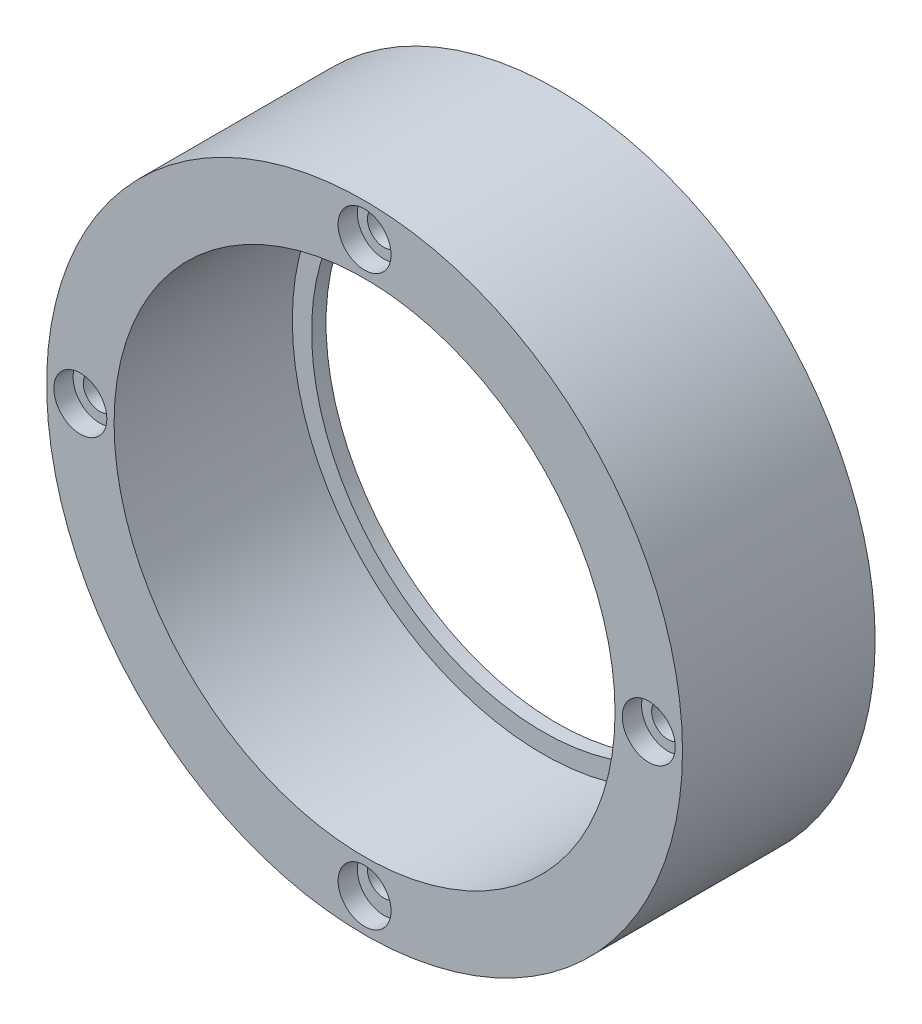
ISO-10303-21;
HEADER;
FILE_DESCRIPTION(('STEP AP214'),'2;1');
FILE_NAME('part.step','',(''),(''),'','','');
FILE_SCHEMA(('AUTOMOTIVE_DESIGN { 1 0 10303 214 1 1 1 1 }'));
ENDSEC;
DATA;
#1=APPLICATION_CONTEXT('core data for automotive mechanical design processes');
#2=APPLICATION_PROTOCOL_DEFINITION('international standard','automotive_design',2000,#1);
#3=PRODUCT_CONTEXT('',#1,'mechanical');
#4=PRODUCT('Part','Part','',(#3));
#5=PRODUCT_RELATED_PRODUCT_CATEGORY('part','',(#4));
#6=PRODUCT_DEFINITION_FORMATION('','',#4);
#7=PRODUCT_DEFINITION_CONTEXT('part definition',#1,'design');
#8=PRODUCT_DEFINITION('design','',#6,#7);
#9=PRODUCT_DEFINITION_SHAPE('','',#8);
#10=(LENGTH_UNIT() NAMED_UNIT(*) SI_UNIT(.MILLI.,.METRE.));
#11=(NAMED_UNIT(*) PLANE_ANGLE_UNIT() SI_UNIT($,.RADIAN.));
#12=(NAMED_UNIT(*) SI_UNIT($,.STERADIAN.) SOLID_ANGLE_UNIT());
#13=UNCERTAINTY_MEASURE_WITH_UNIT(LENGTH_MEASURE(1.E-05),#10,'distance_accuracy_value','');
#14=(GEOMETRIC_REPRESENTATION_CONTEXT(3) GLOBAL_UNCERTAINTY_ASSIGNED_CONTEXT((#13)) GLOBAL_UNIT_ASSIGNED_CONTEXT((#10,
#11,#12)) REPRESENTATION_CONTEXT('',''));
#15=CARTESIAN_POINT('',(0.,0.,0.));
#16=DIRECTION('',(0.,0.,1.));
#17=DIRECTION('',(1.,0.,0.));
#18=AXIS2_PLACEMENT_3D('',#15,#16,#17);
#19=CARTESIAN_POINT('',(-29.5,0.,0.));
#20=DIRECTION('',(0.,0.,1.));
#21=DIRECTION('',(1.,0.,0.));
#22=AXIS2_PLACEMENT_3D('',#19,#20,#21);
#23=CYLINDRICAL_SURFACE('',#22,1.7);
#24=CARTESIAN_POINT('',(-29.5,0.,0.));
#25=DIRECTION('',(0.,0.,1.));
#26=DIRECTION('',(1.,0.,0.));
#27=AXIS2_PLACEMENT_3D('',#24,#25,#26);
#28=CIRCLE('',#27,1.7);
#29=CARTESIAN_POINT('',(-27.8,0.,0.));
#30=VERTEX_POINT('',#29);
#31=EDGE_CURVE('E76',#30,#30,#28,.T.);
#32=ORIENTED_EDGE('',*,*,#31,.F.);
#33=EDGE_LOOP('',(#32));
#34=FACE_BOUND('',#33,.T.);
#35=CARTESIAN_POINT('',(-29.5,0.,18.));
#36=DIRECTION('',(0.,0.,1.));
#37=DIRECTION('',(1.,0.,0.));
#38=AXIS2_PLACEMENT_3D('',#35,#36,#37);
#39=CIRCLE('',#38,1.7);
#40=CARTESIAN_POINT('',(-27.8,0.,18.));
#41=VERTEX_POINT('',#40);
#42=EDGE_CURVE('E46',#41,#41,#39,.F.);
#43=ORIENTED_EDGE('',*,*,#42,.F.);
#44=EDGE_LOOP('',(#43));
#45=FACE_BOUND('',#44,.T.);
#46=ADVANCED_FACE('F42',(#34,#45),#23,.F.);
#47=CARTESIAN_POINT('',(0.,-29.,0.));
#48=DIRECTION('',(0.,0.,1.));
#49=DIRECTION('',(1.,0.,0.));
#50=AXIS2_PLACEMENT_3D('',#47,#48,#49);
#51=CYLINDRICAL_SURFACE('',#50,1.7);
#52=CARTESIAN_POINT('',(0.,-29.,0.));
#53=DIRECTION('',(0.,0.,1.));
#54=DIRECTION('',(1.,0.,0.));
#55=AXIS2_PLACEMENT_3D('',#52,#53,#54);
#56=CIRCLE('',#55,1.7);
#57=CARTESIAN_POINT('',(1.7,-29.,0.));
#58=VERTEX_POINT('',#57);
#59=EDGE_CURVE('E81',#58,#58,#56,.T.);
#60=ORIENTED_EDGE('',*,*,#59,.F.);
#61=EDGE_LOOP('',(#60));
#62=FACE_BOUND('',#61,.T.);
#63=CARTESIAN_POINT('',(0.,-29.,18.));
#64=DIRECTION('',(0.,0.,1.));
#65=DIRECTION('',(1.,0.,0.));
#66=AXIS2_PLACEMENT_3D('',#63,#64,#65);
#67=CIRCLE('',#66,1.7);
#68=CARTESIAN_POINT('',(1.7,-29.,18.));
#69=VERTEX_POINT('',#68);
#70=EDGE_CURVE('E69',#69,#69,#67,.F.);
#71=ORIENTED_EDGE('',*,*,#70,.F.);
#72=EDGE_LOOP('',(#71));
#73=FACE_BOUND('',#72,.T.);
#74=ADVANCED_FACE('F126',(#62,#73),#51,.F.);
#75=CARTESIAN_POINT('',(29.5,0.,0.));
#76=DIRECTION('',(0.,0.,1.));
#77=DIRECTION('',(1.,0.,0.));
#78=AXIS2_PLACEMENT_3D('',#75,#76,#77);
#79=CYLINDRICAL_SURFACE('',#78,1.7);
#80=CARTESIAN_POINT('',(29.5,0.,0.));
#81=DIRECTION('',(0.,0.,1.));
#82=DIRECTION('',(1.,0.,0.));
#83=AXIS2_PLACEMENT_3D('',#80,#81,#82);
#84=CIRCLE('',#83,1.7);
#85=CARTESIAN_POINT('',(31.2,0.,0.));
#86=VERTEX_POINT('',#85);
#87=EDGE_CURVE('E87',#86,#86,#84,.T.);
#88=ORIENTED_EDGE('',*,*,#87,.F.);
#89=EDGE_LOOP('',(#88));
#90=FACE_BOUND('',#89,.T.);
#91=CARTESIAN_POINT('',(29.5,0.,18.));
#92=DIRECTION('',(0.,0.,1.));
#93=DIRECTION('',(1.,0.,0.));
#94=AXIS2_PLACEMENT_3D('',#91,#92,#93);
#95=CIRCLE('',#94,1.7);
#96=CARTESIAN_POINT('',(31.2,0.,18.));
#97=VERTEX_POINT('',#96);
#98=EDGE_CURVE('E65',#97,#97,#95,.F.);
#99=ORIENTED_EDGE('',*,*,#98,.F.);
#100=EDGE_LOOP('',(#99));
#101=FACE_BOUND('',#100,.T.);
#102=ADVANCED_FACE('F133',(#90,#101),#79,.F.);
#103=CARTESIAN_POINT('',(0.,29.5,0.));
#104=DIRECTION('',(0.,0.,1.));
#105=DIRECTION('',(1.,0.,0.));
#106=AXIS2_PLACEMENT_3D('',#103,#104,#105);
#107=CYLINDRICAL_SURFACE('',#106,1.7);
#108=CARTESIAN_POINT('',(0.,29.5,0.));
#109=DIRECTION('',(0.,0.,1.));
#110=DIRECTION('',(1.,0.,0.));
#111=AXIS2_PLACEMENT_3D('',#108,#109,#110);
#112=CIRCLE('',#111,1.7);
#113=CARTESIAN_POINT('',(1.7,29.5,0.));
#114=VERTEX_POINT('',#113);
#115=EDGE_CURVE('E100',#114,#114,#112,.T.);
#116=ORIENTED_EDGE('',*,*,#115,.F.);
#117=EDGE_LOOP('',(#116));
#118=FACE_BOUND('',#117,.T.);
#119=CARTESIAN_POINT('',(0.,29.5,18.));
#120=DIRECTION('',(0.,0.,1.));
#121=DIRECTION('',(1.,0.,0.));
#122=AXIS2_PLACEMENT_3D('',#119,#120,#121);
#123=CIRCLE('',#122,1.7);
#124=CARTESIAN_POINT('',(1.7,29.5,18.));
#125=VERTEX_POINT('',#124);
#126=EDGE_CURVE('E61',#125,#125,#123,.F.);
#127=ORIENTED_EDGE('',*,*,#126,.F.);
#128=EDGE_LOOP('',(#127));
#129=FACE_BOUND('',#128,.T.);
#130=ADVANCED_FACE('F153',(#118,#129),#107,.F.);
#131=CARTESIAN_POINT('',(0.,0.,1.5));
#132=DIRECTION('',(0.,0.,1.));
#133=DIRECTION('',(1.,0.,0.));
#134=AXIS2_PLACEMENT_3D('',#131,#132,#133);
#135=PLANE('',#134);
#136=CARTESIAN_POINT('',(0.,0.,1.5));
#137=DIRECTION('',(0.,0.,1.));
#138=DIRECTION('',(1.,0.,0.));
#139=AXIS2_PLACEMENT_3D('',#136,#137,#138);
#140=CIRCLE('',#139,24.);
#141=CARTESIAN_POINT('',(24.,0.,1.5));
#142=VERTEX_POINT('',#141);
#143=EDGE_CURVE('E51',#142,#142,#140,.T.);
#144=ORIENTED_EDGE('',*,*,#143,.F.);
#145=EDGE_LOOP('',(#144));
#146=FACE_BOUND('',#145,.T.);
#147=CARTESIAN_POINT('',(0.,0.,1.5));
#148=DIRECTION('',(0.,0.,1.));
#149=DIRECTION('',(1.,0.,0.));
#150=AXIS2_PLACEMENT_3D('',#147,#148,#149);
#151=CIRCLE('',#150,26.);
#152=CARTESIAN_POINT('',(26.,0.,1.5));
#153=VERTEX_POINT('',#152);
#154=EDGE_CURVE('E96',#153,#153,#151,.T.);
#155=ORIENTED_EDGE('',*,*,#154,.T.);
#156=EDGE_LOOP('',(#155));
#157=FACE_BOUND('',#156,.T.);
#158=ADVANCED_FACE('F152',(#146,#157),#135,.T.);
#159=CARTESIAN_POINT('',(0.,0.,0.));
#160=DIRECTION('',(0.,0.,1.));
#161=DIRECTION('',(1.,0.,0.));
#162=AXIS2_PLACEMENT_3D('',#159,#160,#161);
#163=PLANE('',#162);
#164=ORIENTED_EDGE('',*,*,#115,.T.);
#165=EDGE_LOOP('',(#164));
#166=FACE_BOUND('',#165,.T.);
#167=ORIENTED_EDGE('',*,*,#87,.T.);
#168=EDGE_LOOP('',(#167));
#169=FACE_BOUND('',#168,.T.);
#170=ORIENTED_EDGE('',*,*,#59,.T.);
#171=EDGE_LOOP('',(#170));
#172=FACE_BOUND('',#171,.T.);
#173=ORIENTED_EDGE('',*,*,#31,.T.);
#174=EDGE_LOOP('',(#173));
#175=FACE_BOUND('',#174,.T.);
#176=CARTESIAN_POINT('',(0.,0.,0.));
#177=DIRECTION('',(0.,0.,1.));
#178=DIRECTION('',(1.,0.,0.));
#179=AXIS2_PLACEMENT_3D('',#176,#177,#178);
#180=CIRCLE('',#179,33.);
#181=CARTESIAN_POINT('',(33.,0.,0.));
#182=VERTEX_POINT('',#181);
#183=EDGE_CURVE('E10',#182,#182,#180,.T.);
#184=ORIENTED_EDGE('',*,*,#183,.F.);
#185=EDGE_LOOP('',(#184));
#186=FACE_BOUND('',#185,.T.);
#187=CARTESIAN_POINT('',(0.,0.,0.));
#188=DIRECTION('',(0.,0.,1.));
#189=DIRECTION('',(1.,0.,0.));
#190=AXIS2_PLACEMENT_3D('',#187,#188,#189);
#191=CIRCLE('',#190,24.);
#192=CARTESIAN_POINT('',(24.,0.,0.));
#193=VERTEX_POINT('',#192);
#194=EDGE_CURVE('E57',#193,#193,#191,.T.);
#195=ORIENTED_EDGE('',*,*,#194,.T.);
#196=EDGE_LOOP('',(#195));
#197=FACE_BOUND('',#196,.T.);
#198=ADVANCED_FACE('F109',(#166,#169,#172,#175,#186,#197),#163,.F.);
#199=CARTESIAN_POINT('',(0.,0.,1.5));
#200=DIRECTION('',(0.,0.,-1.));
#201=DIRECTION('',(-1.,0.,0.));
#202=AXIS2_PLACEMENT_3D('',#199,#200,#201);
#203=CYLINDRICAL_SURFACE('',#202,33.);
#204=ORIENTED_EDGE('',*,*,#183,.T.);
#205=EDGE_LOOP('',(#204));
#206=FACE_BOUND('',#205,.T.);
#207=CARTESIAN_POINT('',(0.,0.,20.));
#208=DIRECTION('',(0.,0.,1.));
#209=DIRECTION('',(1.,0.,0.));
#210=AXIS2_PLACEMENT_3D('',#207,#208,#209);
#211=CIRCLE('',#210,33.);
#212=CARTESIAN_POINT('',(33.,0.,20.));
#213=VERTEX_POINT('',#212);
#214=EDGE_CURVE('E95',#213,#213,#211,.T.);
#215=ORIENTED_EDGE('',*,*,#214,.F.);
#216=EDGE_LOOP('',(#215));
#217=FACE_BOUND('',#216,.T.);
#218=ADVANCED_FACE('F44',(#206,#217),#203,.T.);
#219=CARTESIAN_POINT('',(0.,0.,1.5));
#220=DIRECTION('',(0.,0.,-1.));
#221=DIRECTION('',(-1.,0.,0.));
#222=AXIS2_PLACEMENT_3D('',#219,#220,#221);
#223=CYLINDRICAL_SURFACE('',#222,24.);
#224=ORIENTED_EDGE('',*,*,#143,.T.);
#225=EDGE_LOOP('',(#224));
#226=FACE_BOUND('',#225,.T.);
#227=ORIENTED_EDGE('',*,*,#194,.F.);
#228=EDGE_LOOP('',(#227));
#229=FACE_BOUND('',#228,.T.);
#230=ADVANCED_FACE('F111',(#226,#229),#223,.F.);
#231=CARTESIAN_POINT('',(0.,0.,20.));
#232=DIRECTION('',(0.,0.,1.));
#233=DIRECTION('',(1.,0.,0.));
#234=AXIS2_PLACEMENT_3D('',#231,#232,#233);
#235=PLANE('',#234);
#236=CARTESIAN_POINT('',(0.,29.5,20.));
#237=DIRECTION('',(0.,0.,1.));
#238=DIRECTION('',(1.,0.,0.));
#239=AXIS2_PLACEMENT_3D('',#236,#237,#238);
#240=CIRCLE('',#239,2.75);
#241=CARTESIAN_POINT('',(2.75,29.5,20.));
#242=VERTEX_POINT('',#241);
#243=EDGE_CURVE('E202',#242,#242,#240,.T.);
#244=ORIENTED_EDGE('',*,*,#243,.F.);
#245=EDGE_LOOP('',(#244));
#246=FACE_BOUND('',#245,.T.);
#247=CARTESIAN_POINT('',(29.5,-1.02998699495872E-13,20.));
#248=DIRECTION('',(0.,0.,1.));
#249=DIRECTION('',(1.,0.,0.));
#250=AXIS2_PLACEMENT_3D('',#247,#248,#249);
#251=CIRCLE('',#250,2.75);
#252=CARTESIAN_POINT('',(32.25,-1.02998699495872E-13,20.));
#253=VERTEX_POINT('',#252);
#254=EDGE_CURVE('E204',#253,#253,#251,.T.);
#255=ORIENTED_EDGE('',*,*,#254,.F.);
#256=EDGE_LOOP('',(#255));
#257=FACE_BOUND('',#256,.T.);
#258=CARTESIAN_POINT('',(-2.05997398991745E-13,-29.5,20.));
#259=DIRECTION('',(0.,0.,1.));
#260=DIRECTION('',(1.,0.,0.));
#261=AXIS2_PLACEMENT_3D('',#258,#259,#260);
#262=CIRCLE('',#261,2.75);
#263=CARTESIAN_POINT('',(2.74999999999979,-29.5,20.));
#264=VERTEX_POINT('',#263);
#265=EDGE_CURVE('E216',#264,#264,#262,.T.);
#266=ORIENTED_EDGE('',*,*,#265,.F.);
#267=EDGE_LOOP('',(#266));
#268=FACE_BOUND('',#267,.T.);
#269=CARTESIAN_POINT('',(-29.5,3.08996098487617E-13,20.));
#270=DIRECTION('',(0.,0.,1.));
#271=DIRECTION('',(1.,0.,0.));
#272=AXIS2_PLACEMENT_3D('',#269,#270,#271);
#273=CIRCLE('',#272,2.75);
#274=CARTESIAN_POINT('',(-26.75,3.08996098487617E-13,20.));
#275=VERTEX_POINT('',#274);
#276=EDGE_CURVE('E224',#275,#275,#273,.T.);
#277=ORIENTED_EDGE('',*,*,#276,.F.);
#278=EDGE_LOOP('',(#277));
#279=FACE_BOUND('',#278,.T.);
#280=ORIENTED_EDGE('',*,*,#214,.T.);
#281=EDGE_LOOP('',(#280));
#282=FACE_BOUND('',#281,.T.);
#283=CARTESIAN_POINT('',(0.,0.,20.));
#284=DIRECTION('',(0.,0.,1.));
#285=DIRECTION('',(1.,0.,0.));
#286=AXIS2_PLACEMENT_3D('',#283,#284,#285);
#287=CIRCLE('',#286,26.);
#288=CARTESIAN_POINT('',(26.,0.,20.));
#289=VERTEX_POINT('',#288);
#290=EDGE_CURVE('E91',#289,#289,#287,.T.);
#291=ORIENTED_EDGE('',*,*,#290,.F.);
#292=EDGE_LOOP('',(#291));
#293=FACE_BOUND('',#292,.T.);
#294=ADVANCED_FACE('F113',(#246,#257,#268,#279,#282,#293),#235,.T.);
#295=CARTESIAN_POINT('',(0.,0.,20.));
#296=DIRECTION('',(0.,0.,-1.));
#297=DIRECTION('',(-1.,0.,0.));
#298=AXIS2_PLACEMENT_3D('',#295,#296,#297);
#299=CYLINDRICAL_SURFACE('',#298,26.);
#300=ORIENTED_EDGE('',*,*,#290,.T.);
#301=EDGE_LOOP('',(#300));
#302=FACE_BOUND('',#301,.T.);
#303=ORIENTED_EDGE('',*,*,#154,.F.);
#304=EDGE_LOOP('',(#303));
#305=FACE_BOUND('',#304,.T.);
#306=ADVANCED_FACE('F120',(#302,#305),#299,.F.);
#307=CARTESIAN_POINT('',(0.,29.5,18.));
#308=DIRECTION('',(0.,0.,1.));
#309=DIRECTION('',(1.,0.,0.));
#310=AXIS2_PLACEMENT_3D('',#307,#308,#309);
#311=PLANE('',#310);
#312=CARTESIAN_POINT('',(0.,29.5,18.));
#313=DIRECTION('',(0.,0.,1.));
#314=DIRECTION('',(1.,0.,0.));
#315=AXIS2_PLACEMENT_3D('',#312,#313,#314);
#316=CIRCLE('',#315,2.75);
#317=CARTESIAN_POINT('',(2.75,29.5,18.));
#318=VERTEX_POINT('',#317);
#319=EDGE_CURVE('E66',#318,#318,#316,.T.);
#320=ORIENTED_EDGE('',*,*,#319,.T.);
#321=EDGE_LOOP('',(#320));
#322=FACE_BOUND('',#321,.T.);
#323=ORIENTED_EDGE('',*,*,#126,.T.);
#324=EDGE_LOOP('',(#323));
#325=FACE_BOUND('',#324,.T.);
#326=ADVANCED_FACE('F140',(#322,#325),#311,.T.);
#327=CARTESIAN_POINT('',(0.,29.5,18.));
#328=DIRECTION('',(0.,0.,1.));
#329=DIRECTION('',(1.,0.,0.));
#330=AXIS2_PLACEMENT_3D('',#327,#328,#329);
#331=CYLINDRICAL_SURFACE('',#330,2.75);
#332=ORIENTED_EDGE('',*,*,#319,.F.);
#333=EDGE_LOOP('',(#332));
#334=FACE_BOUND('',#333,.T.);
#335=ORIENTED_EDGE('',*,*,#243,.T.);
#336=EDGE_LOOP('',(#335));
#337=FACE_BOUND('',#336,.T.);
#338=ADVANCED_FACE('F145',(#334,#337),#331,.F.);
#339=CARTESIAN_POINT('',(29.5,-1.02998699495872E-13,18.));
#340=DIRECTION('',(0.,0.,1.));
#341=DIRECTION('',(1.,0.,0.));
#342=AXIS2_PLACEMENT_3D('',#339,#340,#341);
#343=PLANE('',#342);
#344=CARTESIAN_POINT('',(29.5,-1.02998699495872E-13,18.));
#345=DIRECTION('',(0.,0.,1.));
#346=DIRECTION('',(1.,0.,0.));
#347=AXIS2_PLACEMENT_3D('',#344,#345,#346);
#348=CIRCLE('',#347,2.75);
#349=CARTESIAN_POINT('',(32.25,-1.02998699495872E-13,18.));
#350=VERTEX_POINT('',#349);
#351=EDGE_CURVE('E210',#350,#350,#348,.T.);
#352=ORIENTED_EDGE('',*,*,#351,.T.);
#353=EDGE_LOOP('',(#352));
#354=FACE_BOUND('',#353,.T.);
#355=ORIENTED_EDGE('',*,*,#98,.T.);
#356=EDGE_LOOP('',(#355));
#357=FACE_BOUND('',#356,.T.);
#358=ADVANCED_FACE('F186',(#354,#357),#343,.T.);
#359=CARTESIAN_POINT('',(29.5,-1.02998699495872E-13,18.));
#360=DIRECTION('',(0.,0.,1.));
#361=DIRECTION('',(1.,0.,0.));
#362=AXIS2_PLACEMENT_3D('',#359,#360,#361);
#363=CYLINDRICAL_SURFACE('',#362,2.75);
#364=ORIENTED_EDGE('',*,*,#351,.F.);
#365=EDGE_LOOP('',(#364));
#366=FACE_BOUND('',#365,.T.);
#367=ORIENTED_EDGE('',*,*,#254,.T.);
#368=EDGE_LOOP('',(#367));
#369=FACE_BOUND('',#368,.T.);
#370=ADVANCED_FACE('F181',(#366,#369),#363,.F.);
#371=CARTESIAN_POINT('',(-2.05997398991745E-13,-29.5,18.));
#372=DIRECTION('',(0.,0.,1.));
#373=DIRECTION('',(1.,0.,0.));
#374=AXIS2_PLACEMENT_3D('',#371,#372,#373);
#375=PLANE('',#374);
#376=CARTESIAN_POINT('',(-2.05997398991745E-13,-29.5,18.));
#377=DIRECTION('',(0.,0.,1.));
#378=DIRECTION('',(1.,0.,0.));
#379=AXIS2_PLACEMENT_3D('',#376,#377,#378);
#380=CIRCLE('',#379,2.75);
#381=CARTESIAN_POINT('',(2.74999999999979,-29.5,18.));
#382=VERTEX_POINT('',#381);
#383=EDGE_CURVE('E220',#382,#382,#380,.T.);
#384=ORIENTED_EDGE('',*,*,#383,.T.);
#385=EDGE_LOOP('',(#384));
#386=FACE_BOUND('',#385,.T.);
#387=ORIENTED_EDGE('',*,*,#70,.T.);
#388=EDGE_LOOP('',(#387));
#389=FACE_BOUND('',#388,.T.);
#390=ADVANCED_FACE('F178',(#386,#389),#375,.T.);
#391=CARTESIAN_POINT('',(-2.05997398991745E-13,-29.5,18.));
#392=DIRECTION('',(0.,0.,1.));
#393=DIRECTION('',(1.,0.,0.));
#394=AXIS2_PLACEMENT_3D('',#391,#392,#393);
#395=CYLINDRICAL_SURFACE('',#394,2.75);
#396=ORIENTED_EDGE('',*,*,#383,.F.);
#397=EDGE_LOOP('',(#396));
#398=FACE_BOUND('',#397,.T.);
#399=ORIENTED_EDGE('',*,*,#265,.T.);
#400=EDGE_LOOP('',(#399));
#401=FACE_BOUND('',#400,.T.);
#402=ADVANCED_FACE('F173',(#398,#401),#395,.F.);
#403=CARTESIAN_POINT('',(-29.5,3.08996098487617E-13,18.));
#404=DIRECTION('',(0.,0.,1.));
#405=DIRECTION('',(1.,0.,0.));
#406=AXIS2_PLACEMENT_3D('',#403,#404,#405);
#407=PLANE('',#406);
#408=CARTESIAN_POINT('',(-29.5,3.08996098487617E-13,18.));
#409=DIRECTION('',(0.,0.,1.));
#410=DIRECTION('',(1.,0.,0.));
#411=AXIS2_PLACEMENT_3D('',#408,#409,#410);
#412=CIRCLE('',#411,2.75);
#413=CARTESIAN_POINT('',(-26.75,3.08996098487617E-13,18.));
#414=VERTEX_POINT('',#413);
#415=EDGE_CURVE('E228',#414,#414,#412,.T.);
#416=ORIENTED_EDGE('',*,*,#415,.T.);
#417=EDGE_LOOP('',(#416));
#418=FACE_BOUND('',#417,.T.);
#419=ORIENTED_EDGE('',*,*,#42,.T.);
#420=EDGE_LOOP('',(#419));
#421=FACE_BOUND('',#420,.T.);
#422=ADVANCED_FACE('F169',(#418,#421),#407,.T.);
#423=CARTESIAN_POINT('',(-29.5,3.08996098487617E-13,18.));
#424=DIRECTION('',(0.,0.,1.));
#425=DIRECTION('',(1.,0.,0.));
#426=AXIS2_PLACEMENT_3D('',#423,#424,#425);
#427=CYLINDRICAL_SURFACE('',#426,2.75);
#428=ORIENTED_EDGE('',*,*,#415,.F.);
#429=EDGE_LOOP('',(#428));
#430=FACE_BOUND('',#429,.T.);
#431=ORIENTED_EDGE('',*,*,#276,.T.);
#432=EDGE_LOOP('',(#431));
#433=FACE_BOUND('',#432,.T.);
#434=ADVANCED_FACE('F172',(#430,#433),#427,.F.);
#435=CLOSED_SHELL('',(#46,#74,#102,#130,#158,#198,#218,#230,#294,#306,#326,#338,#358,#370,#390,
#402,#422,#434));
#436=MANIFOLD_SOLID_BREP('B2',#435);
#437=ADVANCED_BREP_SHAPE_REPRESENTATION('',(#18,#436),#14);
#438=SHAPE_DEFINITION_REPRESENTATION(#9,#437);
ENDSEC;
END-ISO-10303-21;
